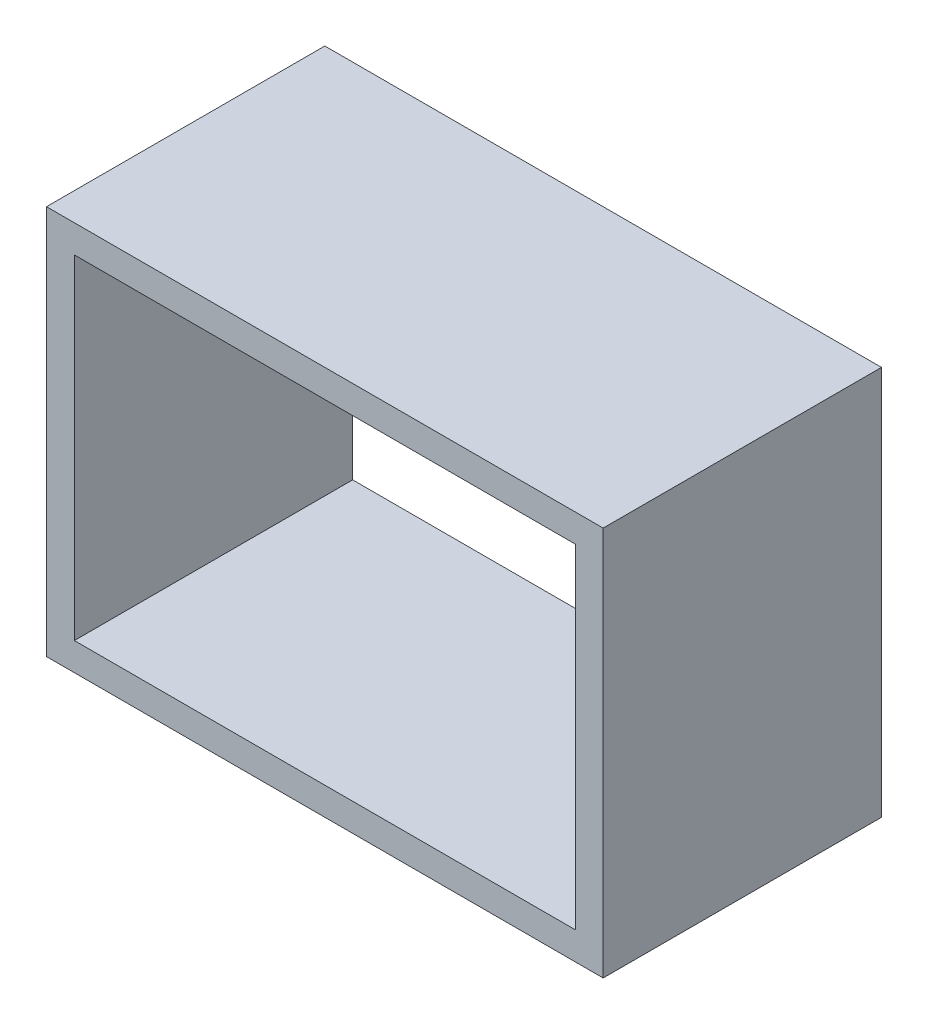
ISO-10303-21;
HEADER;
FILE_DESCRIPTION(('STEP AP214'),'2;1');
FILE_NAME('part.step','',(''),(''),'','','');
FILE_SCHEMA(('AUTOMOTIVE_DESIGN { 1 0 10303 214 1 1 1 1 }'));
ENDSEC;
DATA;
#1=APPLICATION_CONTEXT('core data for automotive mechanical design processes');
#2=APPLICATION_PROTOCOL_DEFINITION('international standard','automotive_design',2000,#1);
#3=PRODUCT_CONTEXT('',#1,'mechanical');
#4=PRODUCT('Part','Part','',(#3));
#5=PRODUCT_RELATED_PRODUCT_CATEGORY('part','',(#4));
#6=PRODUCT_DEFINITION_FORMATION('','',#4);
#7=PRODUCT_DEFINITION_CONTEXT('part definition',#1,'design');
#8=PRODUCT_DEFINITION('design','',#6,#7);
#9=PRODUCT_DEFINITION_SHAPE('','',#8);
#10=(LENGTH_UNIT() NAMED_UNIT(*) SI_UNIT(.MILLI.,.METRE.));
#11=(NAMED_UNIT(*) PLANE_ANGLE_UNIT() SI_UNIT($,.RADIAN.));
#12=(NAMED_UNIT(*) SI_UNIT($,.STERADIAN.) SOLID_ANGLE_UNIT());
#13=UNCERTAINTY_MEASURE_WITH_UNIT(LENGTH_MEASURE(1.E-05),#10,'distance_accuracy_value','');
#14=(GEOMETRIC_REPRESENTATION_CONTEXT(3) GLOBAL_UNCERTAINTY_ASSIGNED_CONTEXT((#13)) GLOBAL_UNIT_ASSIGNED_CONTEXT((#10,
#11,#12)) REPRESENTATION_CONTEXT('',''));
#15=CARTESIAN_POINT('',(0.,0.,0.));
#16=DIRECTION('',(0.,0.,1.));
#17=DIRECTION('',(1.,0.,0.));
#18=AXIS2_PLACEMENT_3D('',#15,#16,#17);
#19=CARTESIAN_POINT('',(0.,0.,100.));
#20=DIRECTION('',(0.,0.,1.));
#21=DIRECTION('',(1.,0.,0.));
#22=AXIS2_PLACEMENT_3D('',#19,#20,#21);
#23=PLANE('',#22);
#24=DIRECTION('',(0.,1.,0.));
#25=VECTOR('',#24,1.);
#26=CARTESIAN_POINT('',(100.,60.,100.));
#27=LINE('',#26,#25);
#28=CARTESIAN_POINT('',(100.,-70.,100.));
#29=VERTEX_POINT('',#28);
#30=CARTESIAN_POINT('',(100.,70.,100.));
#31=VERTEX_POINT('',#30);
#32=EDGE_CURVE('E158',#29,#31,#27,.T.);
#33=ORIENTED_EDGE('',*,*,#32,.T.);
#34=DIRECTION('',(-1.,0.,0.));
#35=VECTOR('',#34,1.);
#36=CARTESIAN_POINT('',(-90.,70.,100.));
#37=LINE('',#36,#35);
#38=CARTESIAN_POINT('',(-100.,70.,100.));
#39=VERTEX_POINT('',#38);
#40=EDGE_CURVE('E161',#31,#39,#37,.T.);
#41=ORIENTED_EDGE('',*,*,#40,.T.);
#42=DIRECTION('',(0.,-1.,0.));
#43=VECTOR('',#42,1.);
#44=CARTESIAN_POINT('',(-100.,60.,100.));
#45=LINE('',#44,#43);
#46=CARTESIAN_POINT('',(-100.,-70.,100.));
#47=VERTEX_POINT('',#46);
#48=EDGE_CURVE('E164',#39,#47,#45,.T.);
#49=ORIENTED_EDGE('',*,*,#48,.T.);
#50=DIRECTION('',(1.,0.,0.));
#51=VECTOR('',#50,1.);
#52=CARTESIAN_POINT('',(-90.,-70.,100.));
#53=LINE('',#52,#51);
#54=EDGE_CURVE('E166',#47,#29,#53,.T.);
#55=ORIENTED_EDGE('',*,*,#54,.T.);
#56=EDGE_LOOP('',(#33,#41,#49,#55));
#57=FACE_BOUND('',#56,.T.);
#58=DIRECTION('',(-1.,0.,0.));
#59=VECTOR('',#58,1.);
#60=CARTESIAN_POINT('',(-90.,60.,100.));
#61=LINE('',#60,#59);
#62=CARTESIAN_POINT('',(90.,60.,100.));
#63=VERTEX_POINT('',#62);
#64=CARTESIAN_POINT('',(-90.,60.,100.));
#65=VERTEX_POINT('',#64);
#66=EDGE_CURVE('E130',#63,#65,#61,.T.);
#67=ORIENTED_EDGE('',*,*,#66,.F.);
#68=DIRECTION('',(0.,1.,0.));
#69=VECTOR('',#68,1.);
#70=CARTESIAN_POINT('',(90.,60.,100.));
#71=LINE('',#70,#69);
#72=CARTESIAN_POINT('',(90.,-60.,100.));
#73=VERTEX_POINT('',#72);
#74=EDGE_CURVE('E122',#73,#63,#71,.T.);
#75=ORIENTED_EDGE('',*,*,#74,.F.);
#76=DIRECTION('',(1.,0.,0.));
#77=VECTOR('',#76,1.);
#78=CARTESIAN_POINT('',(-90.,-60.,100.));
#79=LINE('',#78,#77);
#80=CARTESIAN_POINT('',(-90.,-60.,100.));
#81=VERTEX_POINT('',#80);
#82=EDGE_CURVE('E144',#81,#73,#79,.T.);
#83=ORIENTED_EDGE('',*,*,#82,.F.);
#84=DIRECTION('',(0.,-1.,0.));
#85=VECTOR('',#84,1.);
#86=CARTESIAN_POINT('',(-90.,60.,100.));
#87=LINE('',#86,#85);
#88=EDGE_CURVE('E142',#65,#81,#87,.T.);
#89=ORIENTED_EDGE('',*,*,#88,.F.);
#90=EDGE_LOOP('',(#67,#75,#83,#89));
#91=FACE_BOUND('',#90,.T.);
#92=ADVANCED_FACE('F57',(#57,#91),#23,.T.);
#93=CARTESIAN_POINT('',(0.,0.,0.));
#94=DIRECTION('',(0.,0.,1.));
#95=DIRECTION('',(1.,0.,0.));
#96=AXIS2_PLACEMENT_3D('',#93,#94,#95);
#97=PLANE('',#96);
#98=DIRECTION('',(0.,1.,0.));
#99=VECTOR('',#98,1.);
#100=CARTESIAN_POINT('',(100.,60.,0.));
#101=LINE('',#100,#99);
#102=CARTESIAN_POINT('',(100.,-70.,0.));
#103=VERTEX_POINT('',#102);
#104=CARTESIAN_POINT('',(100.,70.,0.));
#105=VERTEX_POINT('',#104);
#106=EDGE_CURVE('E138',#103,#105,#101,.T.);
#107=ORIENTED_EDGE('',*,*,#106,.F.);
#108=DIRECTION('',(1.,0.,0.));
#109=VECTOR('',#108,1.);
#110=CARTESIAN_POINT('',(-90.,-70.,0.));
#111=LINE('',#110,#109);
#112=CARTESIAN_POINT('',(-100.,-70.,0.));
#113=VERTEX_POINT('',#112);
#114=EDGE_CURVE('E162',#113,#103,#111,.T.);
#115=ORIENTED_EDGE('',*,*,#114,.F.);
#116=DIRECTION('',(0.,-1.,0.));
#117=VECTOR('',#116,1.);
#118=CARTESIAN_POINT('',(-100.,60.,0.));
#119=LINE('',#118,#117);
#120=CARTESIAN_POINT('',(-100.,70.,0.));
#121=VERTEX_POINT('',#120);
#122=EDGE_CURVE('E173',#121,#113,#119,.T.);
#123=ORIENTED_EDGE('',*,*,#122,.F.);
#124=DIRECTION('',(-1.,0.,0.));
#125=VECTOR('',#124,1.);
#126=CARTESIAN_POINT('',(-90.,70.,0.));
#127=LINE('',#126,#125);
#128=EDGE_CURVE('E171',#105,#121,#127,.T.);
#129=ORIENTED_EDGE('',*,*,#128,.F.);
#130=EDGE_LOOP('',(#107,#115,#123,#129));
#131=FACE_BOUND('',#130,.T.);
#132=DIRECTION('',(0.,1.,0.));
#133=VECTOR('',#132,1.);
#134=CARTESIAN_POINT('',(90.,60.,0.));
#135=LINE('',#134,#133);
#136=CARTESIAN_POINT('',(90.,-60.,0.));
#137=VERTEX_POINT('',#136);
#138=CARTESIAN_POINT('',(90.,60.,0.));
#139=VERTEX_POINT('',#138);
#140=EDGE_CURVE('E80',#137,#139,#135,.T.);
#141=ORIENTED_EDGE('',*,*,#140,.T.);
#142=DIRECTION('',(-1.,0.,0.));
#143=VECTOR('',#142,1.);
#144=CARTESIAN_POINT('',(-90.,60.,0.));
#145=LINE('',#144,#143);
#146=CARTESIAN_POINT('',(-90.,60.,0.));
#147=VERTEX_POINT('',#146);
#148=EDGE_CURVE('E137',#139,#147,#145,.T.);
#149=ORIENTED_EDGE('',*,*,#148,.T.);
#150=DIRECTION('',(0.,-1.,0.));
#151=VECTOR('',#150,1.);
#152=CARTESIAN_POINT('',(-90.,60.,0.));
#153=LINE('',#152,#151);
#154=CARTESIAN_POINT('',(-90.,-60.,0.));
#155=VERTEX_POINT('',#154);
#156=EDGE_CURVE('E150',#147,#155,#153,.T.);
#157=ORIENTED_EDGE('',*,*,#156,.T.);
#158=DIRECTION('',(1.,0.,0.));
#159=VECTOR('',#158,1.);
#160=CARTESIAN_POINT('',(-90.,-60.,0.));
#161=LINE('',#160,#159);
#162=EDGE_CURVE('E131',#155,#137,#161,.T.);
#163=ORIENTED_EDGE('',*,*,#162,.T.);
#164=EDGE_LOOP('',(#141,#149,#157,#163));
#165=FACE_BOUND('',#164,.T.);
#166=ADVANCED_FACE('F191',(#131,#165),#97,.F.);
#167=CARTESIAN_POINT('',(100.,60.,100.));
#168=DIRECTION('',(-1.,0.,0.));
#169=DIRECTION('',(0.,0.,1.));
#170=AXIS2_PLACEMENT_3D('',#167,#168,#169);
#171=PLANE('',#170);
#172=ORIENTED_EDGE('',*,*,#106,.T.);
#173=DIRECTION('',(0.,0.,-1.));
#174=VECTOR('',#173,1.);
#175=CARTESIAN_POINT('',(100.,70.,100.));
#176=LINE('',#175,#174);
#177=EDGE_CURVE('E12',#31,#105,#176,.T.);
#178=ORIENTED_EDGE('',*,*,#177,.F.);
#179=ORIENTED_EDGE('',*,*,#32,.F.);
#180=DIRECTION('',(0.,0.,-1.));
#181=VECTOR('',#180,1.);
#182=CARTESIAN_POINT('',(100.,-70.,100.));
#183=LINE('',#182,#181);
#184=EDGE_CURVE('E168',#29,#103,#183,.T.);
#185=ORIENTED_EDGE('',*,*,#184,.T.);
#186=EDGE_LOOP('',(#172,#178,#179,#185));
#187=FACE_BOUND('',#186,.T.);
#188=ADVANCED_FACE('F59',(#187),#171,.F.);
#189=CARTESIAN_POINT('',(-90.,70.,100.));
#190=DIRECTION('',(0.,-1.,0.));
#191=DIRECTION('',(0.,0.,-1.));
#192=AXIS2_PLACEMENT_3D('',#189,#190,#191);
#193=PLANE('',#192);
#194=ORIENTED_EDGE('',*,*,#128,.T.);
#195=DIRECTION('',(0.,0.,-1.));
#196=VECTOR('',#195,1.);
#197=CARTESIAN_POINT('',(-100.,70.,100.));
#198=LINE('',#197,#196);
#199=EDGE_CURVE('E65',#39,#121,#198,.T.);
#200=ORIENTED_EDGE('',*,*,#199,.F.);
#201=ORIENTED_EDGE('',*,*,#40,.F.);
#202=ORIENTED_EDGE('',*,*,#177,.T.);
#203=EDGE_LOOP('',(#194,#200,#201,#202));
#204=FACE_BOUND('',#203,.T.);
#205=ADVANCED_FACE('F201',(#204),#193,.F.);
#206=CARTESIAN_POINT('',(-100.,60.,100.));
#207=DIRECTION('',(1.,0.,0.));
#208=DIRECTION('',(0.,0.,-1.));
#209=AXIS2_PLACEMENT_3D('',#206,#207,#208);
#210=PLANE('',#209);
#211=ORIENTED_EDGE('',*,*,#122,.T.);
#212=DIRECTION('',(0.,0.,-1.));
#213=VECTOR('',#212,1.);
#214=CARTESIAN_POINT('',(-100.,-70.,100.));
#215=LINE('',#214,#213);
#216=EDGE_CURVE('E178',#47,#113,#215,.T.);
#217=ORIENTED_EDGE('',*,*,#216,.F.);
#218=ORIENTED_EDGE('',*,*,#48,.F.);
#219=ORIENTED_EDGE('',*,*,#199,.T.);
#220=EDGE_LOOP('',(#211,#217,#218,#219));
#221=FACE_BOUND('',#220,.T.);
#222=ADVANCED_FACE('F185',(#221),#210,.F.);
#223=CARTESIAN_POINT('',(-90.,-70.,100.));
#224=DIRECTION('',(0.,1.,0.));
#225=DIRECTION('',(0.,0.,1.));
#226=AXIS2_PLACEMENT_3D('',#223,#224,#225);
#227=PLANE('',#226);
#228=ORIENTED_EDGE('',*,*,#114,.T.);
#229=ORIENTED_EDGE('',*,*,#184,.F.);
#230=ORIENTED_EDGE('',*,*,#54,.F.);
#231=ORIENTED_EDGE('',*,*,#216,.T.);
#232=EDGE_LOOP('',(#228,#229,#230,#231));
#233=FACE_BOUND('',#232,.T.);
#234=ADVANCED_FACE('F195',(#233),#227,.F.);
#235=CARTESIAN_POINT('',(90.,60.,100.));
#236=DIRECTION('',(-1.,0.,0.));
#237=DIRECTION('',(0.,0.,1.));
#238=AXIS2_PLACEMENT_3D('',#235,#236,#237);
#239=PLANE('',#238);
#240=ORIENTED_EDGE('',*,*,#140,.F.);
#241=DIRECTION('',(0.,0.,-1.));
#242=VECTOR('',#241,1.);
#243=CARTESIAN_POINT('',(90.,-60.,100.));
#244=LINE('',#243,#242);
#245=EDGE_CURVE('E126',#73,#137,#244,.T.);
#246=ORIENTED_EDGE('',*,*,#245,.F.);
#247=ORIENTED_EDGE('',*,*,#74,.T.);
#248=DIRECTION('',(0.,0.,-1.));
#249=VECTOR('',#248,1.);
#250=CARTESIAN_POINT('',(90.,60.,100.));
#251=LINE('',#250,#249);
#252=EDGE_CURVE('E125',#63,#139,#251,.T.);
#253=ORIENTED_EDGE('',*,*,#252,.T.);
#254=EDGE_LOOP('',(#240,#246,#247,#253));
#255=FACE_BOUND('',#254,.T.);
#256=ADVANCED_FACE('F124',(#255),#239,.T.);
#257=CARTESIAN_POINT('',(-90.,60.,100.));
#258=DIRECTION('',(0.,-1.,0.));
#259=DIRECTION('',(0.,0.,-1.));
#260=AXIS2_PLACEMENT_3D('',#257,#258,#259);
#261=PLANE('',#260);
#262=ORIENTED_EDGE('',*,*,#148,.F.);
#263=ORIENTED_EDGE('',*,*,#252,.F.);
#264=ORIENTED_EDGE('',*,*,#66,.T.);
#265=DIRECTION('',(0.,0.,-1.));
#266=VECTOR('',#265,1.);
#267=CARTESIAN_POINT('',(-90.,60.,100.));
#268=LINE('',#267,#266);
#269=EDGE_CURVE('E139',#65,#147,#268,.T.);
#270=ORIENTED_EDGE('',*,*,#269,.T.);
#271=EDGE_LOOP('',(#262,#263,#264,#270));
#272=FACE_BOUND('',#271,.T.);
#273=ADVANCED_FACE('F134',(#272),#261,.T.);
#274=CARTESIAN_POINT('',(-90.,60.,100.));
#275=DIRECTION('',(1.,0.,0.));
#276=DIRECTION('',(0.,0.,-1.));
#277=AXIS2_PLACEMENT_3D('',#274,#275,#276);
#278=PLANE('',#277);
#279=ORIENTED_EDGE('',*,*,#156,.F.);
#280=ORIENTED_EDGE('',*,*,#269,.F.);
#281=ORIENTED_EDGE('',*,*,#88,.T.);
#282=DIRECTION('',(0.,0.,-1.));
#283=VECTOR('',#282,1.);
#284=CARTESIAN_POINT('',(-90.,-60.,100.));
#285=LINE('',#284,#283);
#286=EDGE_CURVE('E72',#81,#155,#285,.T.);
#287=ORIENTED_EDGE('',*,*,#286,.T.);
#288=EDGE_LOOP('',(#279,#280,#281,#287));
#289=FACE_BOUND('',#288,.T.);
#290=ADVANCED_FACE('F224',(#289),#278,.T.);
#291=CARTESIAN_POINT('',(-90.,-60.,100.));
#292=DIRECTION('',(0.,1.,0.));
#293=DIRECTION('',(0.,0.,1.));
#294=AXIS2_PLACEMENT_3D('',#291,#292,#293);
#295=PLANE('',#294);
#296=ORIENTED_EDGE('',*,*,#162,.F.);
#297=ORIENTED_EDGE('',*,*,#286,.F.);
#298=ORIENTED_EDGE('',*,*,#82,.T.);
#299=ORIENTED_EDGE('',*,*,#245,.T.);
#300=EDGE_LOOP('',(#296,#297,#298,#299));
#301=FACE_BOUND('',#300,.T.);
#302=ADVANCED_FACE('F228',(#301),#295,.T.);
#303=CLOSED_SHELL('',(#92,#166,#188,#205,#222,#234,#256,#273,#290,#302));
#304=MANIFOLD_SOLID_BREP('B2',#303);
#305=ADVANCED_BREP_SHAPE_REPRESENTATION('',(#18,#304),#14);
#306=SHAPE_DEFINITION_REPRESENTATION(#9,#305);
ENDSEC;
END-ISO-10303-21;
